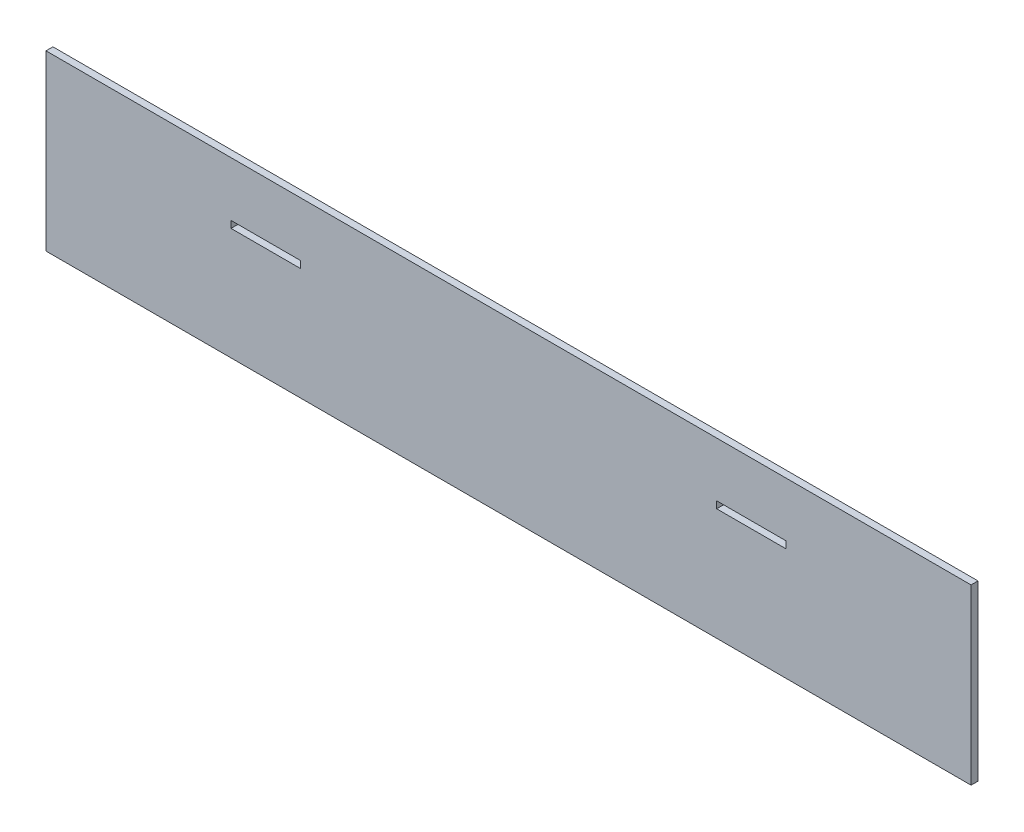
ISO-10303-21;
HEADER;
FILE_DESCRIPTION(('STEP AP214'),'2;1');
FILE_NAME('part.step','',(''),(''),'','','');
FILE_SCHEMA(('AUTOMOTIVE_DESIGN { 1 0 10303 214 1 1 1 1 }'));
ENDSEC;
DATA;
#1=APPLICATION_CONTEXT('core data for automotive mechanical design processes');
#2=APPLICATION_PROTOCOL_DEFINITION('international standard','automotive_design',2000,#1);
#3=PRODUCT_CONTEXT('',#1,'mechanical');
#4=PRODUCT('Part','Part','',(#3));
#5=PRODUCT_RELATED_PRODUCT_CATEGORY('part','',(#4));
#6=PRODUCT_DEFINITION_FORMATION('','',#4);
#7=PRODUCT_DEFINITION_CONTEXT('part definition',#1,'design');
#8=PRODUCT_DEFINITION('design','',#6,#7);
#9=PRODUCT_DEFINITION_SHAPE('','',#8);
#10=(LENGTH_UNIT() NAMED_UNIT(*) SI_UNIT(.MILLI.,.METRE.));
#11=(NAMED_UNIT(*) PLANE_ANGLE_UNIT() SI_UNIT($,.RADIAN.));
#12=(NAMED_UNIT(*) SI_UNIT($,.STERADIAN.) SOLID_ANGLE_UNIT());
#13=UNCERTAINTY_MEASURE_WITH_UNIT(LENGTH_MEASURE(1.E-05),#10,'distance_accuracy_value','');
#14=(GEOMETRIC_REPRESENTATION_CONTEXT(3) GLOBAL_UNCERTAINTY_ASSIGNED_CONTEXT((#13)) GLOBAL_UNIT_ASSIGNED_CONTEXT((#10,
#11,#12)) REPRESENTATION_CONTEXT('',''));
#15=CARTESIAN_POINT('',(0.,0.,0.));
#16=DIRECTION('',(0.,0.,1.));
#17=DIRECTION('',(1.,0.,0.));
#18=AXIS2_PLACEMENT_3D('',#15,#16,#17);
#19=CARTESIAN_POINT('',(0.,0.,3.));
#20=DIRECTION('',(0.,0.,1.));
#21=DIRECTION('',(1.,0.,0.));
#22=AXIS2_PLACEMENT_3D('',#19,#20,#21);
#23=PLANE('',#22);
#24=DIRECTION('',(0.,1.,0.));
#25=VECTOR('',#24,1.);
#26=CARTESIAN_POINT('',(200.,37.5,3.));
#27=LINE('',#26,#25);
#28=CARTESIAN_POINT('',(200.,-37.5,3.));
#29=VERTEX_POINT('',#28);
#30=CARTESIAN_POINT('',(200.,37.5,3.));
#31=VERTEX_POINT('',#30);
#32=EDGE_CURVE('E228',#29,#31,#27,.T.);
#33=ORIENTED_EDGE('',*,*,#32,.T.);
#34=DIRECTION('',(-1.,0.,0.));
#35=VECTOR('',#34,1.);
#36=CARTESIAN_POINT('',(-200.,37.5,3.));
#37=LINE('',#36,#35);
#38=CARTESIAN_POINT('',(-200.,37.5,3.));
#39=VERTEX_POINT('',#38);
#40=EDGE_CURVE('E232',#31,#39,#37,.T.);
#41=ORIENTED_EDGE('',*,*,#40,.T.);
#42=DIRECTION('',(0.,-1.,0.));
#43=VECTOR('',#42,1.);
#44=CARTESIAN_POINT('',(-200.,37.5,3.));
#45=LINE('',#44,#43);
#46=CARTESIAN_POINT('',(-200.,-37.5,3.));
#47=VERTEX_POINT('',#46);
#48=EDGE_CURVE('E236',#39,#47,#45,.T.);
#49=ORIENTED_EDGE('',*,*,#48,.T.);
#50=DIRECTION('',(1.,0.,0.));
#51=VECTOR('',#50,1.);
#52=CARTESIAN_POINT('',(-200.,-37.5,3.));
#53=LINE('',#52,#51);
#54=EDGE_CURVE('E239',#47,#29,#53,.T.);
#55=ORIENTED_EDGE('',*,*,#54,.T.);
#56=EDGE_LOOP('',(#33,#41,#49,#55));
#57=FACE_BOUND('',#56,.T.);
#58=DIRECTION('',(-1.,0.,0.));
#59=VECTOR('',#58,1.);
#60=CARTESIAN_POINT('',(-120.,14.,3.));
#61=LINE('',#60,#59);
#62=CARTESIAN_POINT('',(-90.,14.,3.));
#63=VERTEX_POINT('',#62);
#64=CARTESIAN_POINT('',(-120.,14.,3.));
#65=VERTEX_POINT('',#64);
#66=EDGE_CURVE('E188',#63,#65,#61,.T.);
#67=ORIENTED_EDGE('',*,*,#66,.F.);
#68=DIRECTION('',(0.,1.,0.));
#69=VECTOR('',#68,1.);
#70=CARTESIAN_POINT('',(-90.,14.,3.));
#71=LINE('',#70,#69);
#72=CARTESIAN_POINT('',(-90.,11.,3.));
#73=VERTEX_POINT('',#72);
#74=EDGE_CURVE('E185',#73,#63,#71,.T.);
#75=ORIENTED_EDGE('',*,*,#74,.F.);
#76=DIRECTION('',(1.,0.,0.));
#77=VECTOR('',#76,1.);
#78=CARTESIAN_POINT('',(-120.,11.,3.));
#79=LINE('',#78,#77);
#80=CARTESIAN_POINT('',(-120.,11.,3.));
#81=VERTEX_POINT('',#80);
#82=EDGE_CURVE('E196',#81,#73,#79,.T.);
#83=ORIENTED_EDGE('',*,*,#82,.F.);
#84=DIRECTION('',(0.,-1.,0.));
#85=VECTOR('',#84,1.);
#86=CARTESIAN_POINT('',(-120.,14.,3.));
#87=LINE('',#86,#85);
#88=EDGE_CURVE('E192',#65,#81,#87,.T.);
#89=ORIENTED_EDGE('',*,*,#88,.F.);
#90=EDGE_LOOP('',(#67,#75,#83,#89));
#91=FACE_BOUND('',#90,.T.);
#92=DIRECTION('',(0.,-1.,0.));
#93=VECTOR('',#92,1.);
#94=CARTESIAN_POINT('',(90.0000000000001,14.,3.));
#95=LINE('',#94,#93);
#96=CARTESIAN_POINT('',(90.0000000000001,14.,3.));
#97=VERTEX_POINT('',#96);
#98=CARTESIAN_POINT('',(90.0000000000001,11.,3.));
#99=VERTEX_POINT('',#98);
#100=EDGE_CURVE('E146',#97,#99,#95,.T.);
#101=ORIENTED_EDGE('',*,*,#100,.F.);
#102=DIRECTION('',(-1.,0.,0.));
#103=VECTOR('',#102,1.);
#104=CARTESIAN_POINT('',(120.,14.,3.));
#105=LINE('',#104,#103);
#106=CARTESIAN_POINT('',(120.,14.,3.));
#107=VERTEX_POINT('',#106);
#108=EDGE_CURVE('E137',#107,#97,#105,.T.);
#109=ORIENTED_EDGE('',*,*,#108,.F.);
#110=DIRECTION('',(0.,1.,0.));
#111=VECTOR('',#110,1.);
#112=CARTESIAN_POINT('',(120.,14.,3.));
#113=LINE('',#112,#111);
#114=CARTESIAN_POINT('',(120.,11.,3.));
#115=VERTEX_POINT('',#114);
#116=EDGE_CURVE('E163',#115,#107,#113,.T.);
#117=ORIENTED_EDGE('',*,*,#116,.F.);
#118=DIRECTION('',(1.,0.,0.));
#119=VECTOR('',#118,1.);
#120=CARTESIAN_POINT('',(120.,11.,3.));
#121=LINE('',#120,#119);
#122=EDGE_CURVE('E159',#99,#115,#121,.T.);
#123=ORIENTED_EDGE('',*,*,#122,.F.);
#124=EDGE_LOOP('',(#101,#109,#117,#123));
#125=FACE_BOUND('',#124,.T.);
#126=ADVANCED_FACE('F47',(#57,#91,#125),#23,.T.);
#127=CARTESIAN_POINT('',(0.,0.,0.));
#128=DIRECTION('',(0.,0.,1.));
#129=DIRECTION('',(1.,0.,0.));
#130=AXIS2_PLACEMENT_3D('',#127,#128,#129);
#131=PLANE('',#130);
#132=DIRECTION('',(0.,1.,0.));
#133=VECTOR('',#132,1.);
#134=CARTESIAN_POINT('',(-90.,14.,0.));
#135=LINE('',#134,#133);
#136=CARTESIAN_POINT('',(-90.,11.,0.));
#137=VERTEX_POINT('',#136);
#138=CARTESIAN_POINT('',(-90.,14.,0.));
#139=VERTEX_POINT('',#138);
#140=EDGE_CURVE('E155',#137,#139,#135,.T.);
#141=ORIENTED_EDGE('',*,*,#140,.T.);
#142=DIRECTION('',(-1.,0.,0.));
#143=VECTOR('',#142,1.);
#144=CARTESIAN_POINT('',(-120.,14.,0.));
#145=LINE('',#144,#143);
#146=CARTESIAN_POINT('',(-120.,14.,0.));
#147=VERTEX_POINT('',#146);
#148=EDGE_CURVE('E203',#139,#147,#145,.T.);
#149=ORIENTED_EDGE('',*,*,#148,.T.);
#150=DIRECTION('',(0.,-1.,0.));
#151=VECTOR('',#150,1.);
#152=CARTESIAN_POINT('',(-120.,14.,0.));
#153=LINE('',#152,#151);
#154=CARTESIAN_POINT('',(-120.,11.,0.));
#155=VERTEX_POINT('',#154);
#156=EDGE_CURVE('E207',#147,#155,#153,.T.);
#157=ORIENTED_EDGE('',*,*,#156,.T.);
#158=DIRECTION('',(1.,0.,0.));
#159=VECTOR('',#158,1.);
#160=CARTESIAN_POINT('',(-120.,11.,0.));
#161=LINE('',#160,#159);
#162=EDGE_CURVE('E189',#155,#137,#161,.T.);
#163=ORIENTED_EDGE('',*,*,#162,.T.);
#164=EDGE_LOOP('',(#141,#149,#157,#163));
#165=FACE_BOUND('',#164,.T.);
#166=DIRECTION('',(0.,1.,0.));
#167=VECTOR('',#166,1.);
#168=CARTESIAN_POINT('',(200.,37.5,0.));
#169=LINE('',#168,#167);
#170=CARTESIAN_POINT('',(200.,-37.5,0.));
#171=VERTEX_POINT('',#170);
#172=CARTESIAN_POINT('',(200.,37.5,0.));
#173=VERTEX_POINT('',#172);
#174=EDGE_CURVE('E227',#171,#173,#169,.T.);
#175=ORIENTED_EDGE('',*,*,#174,.F.);
#176=DIRECTION('',(1.,0.,0.));
#177=VECTOR('',#176,1.);
#178=CARTESIAN_POINT('',(-200.,-37.5,0.));
#179=LINE('',#178,#177);
#180=CARTESIAN_POINT('',(-200.,-37.5,0.));
#181=VERTEX_POINT('',#180);
#182=EDGE_CURVE('E233',#181,#171,#179,.T.);
#183=ORIENTED_EDGE('',*,*,#182,.F.);
#184=DIRECTION('',(0.,-1.,0.));
#185=VECTOR('',#184,1.);
#186=CARTESIAN_POINT('',(-200.,37.5,0.));
#187=LINE('',#186,#185);
#188=CARTESIAN_POINT('',(-200.,37.5,0.));
#189=VERTEX_POINT('',#188);
#190=EDGE_CURVE('E249',#189,#181,#187,.T.);
#191=ORIENTED_EDGE('',*,*,#190,.F.);
#192=DIRECTION('',(-1.,0.,0.));
#193=VECTOR('',#192,1.);
#194=CARTESIAN_POINT('',(-200.,37.5,0.));
#195=LINE('',#194,#193);
#196=EDGE_CURVE('E246',#173,#189,#195,.T.);
#197=ORIENTED_EDGE('',*,*,#196,.F.);
#198=EDGE_LOOP('',(#175,#183,#191,#197));
#199=FACE_BOUND('',#198,.T.);
#200=DIRECTION('',(-1.,0.,0.));
#201=VECTOR('',#200,1.);
#202=CARTESIAN_POINT('',(120.,14.,0.));
#203=LINE('',#202,#201);
#204=CARTESIAN_POINT('',(120.,14.,0.));
#205=VERTEX_POINT('',#204);
#206=CARTESIAN_POINT('',(90.0000000000001,14.,0.));
#207=VERTEX_POINT('',#206);
#208=EDGE_CURVE('E71',#205,#207,#203,.T.);
#209=ORIENTED_EDGE('',*,*,#208,.T.);
#210=DIRECTION('',(0.,-1.,0.));
#211=VECTOR('',#210,1.);
#212=CARTESIAN_POINT('',(90.0000000000001,14.,0.));
#213=LINE('',#212,#211);
#214=CARTESIAN_POINT('',(90.0000000000001,11.,0.));
#215=VERTEX_POINT('',#214);
#216=EDGE_CURVE('E153',#207,#215,#213,.T.);
#217=ORIENTED_EDGE('',*,*,#216,.T.);
#218=DIRECTION('',(1.,0.,0.));
#219=VECTOR('',#218,1.);
#220=CARTESIAN_POINT('',(120.,11.,0.));
#221=LINE('',#220,#219);
#222=CARTESIAN_POINT('',(120.,11.,0.));
#223=VERTEX_POINT('',#222);
#224=EDGE_CURVE('E172',#215,#223,#221,.T.);
#225=ORIENTED_EDGE('',*,*,#224,.T.);
#226=DIRECTION('',(0.,1.,0.));
#227=VECTOR('',#226,1.);
#228=CARTESIAN_POINT('',(120.,14.,0.));
#229=LINE('',#228,#227);
#230=EDGE_CURVE('E147',#223,#205,#229,.T.);
#231=ORIENTED_EDGE('',*,*,#230,.T.);
#232=EDGE_LOOP('',(#209,#217,#225,#231));
#233=FACE_BOUND('',#232,.T.);
#234=ADVANCED_FACE('F272',(#165,#199,#233),#131,.F.);
#235=CARTESIAN_POINT('',(200.,37.5,3.));
#236=DIRECTION('',(-1.,0.,0.));
#237=DIRECTION('',(0.,0.,1.));
#238=AXIS2_PLACEMENT_3D('',#235,#236,#237);
#239=PLANE('',#238);
#240=ORIENTED_EDGE('',*,*,#174,.T.);
#241=DIRECTION('',(0.,0.,-1.));
#242=VECTOR('',#241,1.);
#243=CARTESIAN_POINT('',(200.,37.5,3.));
#244=LINE('',#243,#242);
#245=EDGE_CURVE('E11',#31,#173,#244,.T.);
#246=ORIENTED_EDGE('',*,*,#245,.F.);
#247=ORIENTED_EDGE('',*,*,#32,.F.);
#248=DIRECTION('',(0.,0.,-1.));
#249=VECTOR('',#248,1.);
#250=CARTESIAN_POINT('',(200.,-37.5,3.));
#251=LINE('',#250,#249);
#252=EDGE_CURVE('E242',#29,#171,#251,.T.);
#253=ORIENTED_EDGE('',*,*,#252,.T.);
#254=EDGE_LOOP('',(#240,#246,#247,#253));
#255=FACE_BOUND('',#254,.T.);
#256=ADVANCED_FACE('F49',(#255),#239,.F.);
#257=CARTESIAN_POINT('',(-200.,37.5,3.));
#258=DIRECTION('',(0.,-1.,0.));
#259=DIRECTION('',(0.,0.,-1.));
#260=AXIS2_PLACEMENT_3D('',#257,#258,#259);
#261=PLANE('',#260);
#262=ORIENTED_EDGE('',*,*,#196,.T.);
#263=DIRECTION('',(0.,0.,-1.));
#264=VECTOR('',#263,1.);
#265=CARTESIAN_POINT('',(-200.,37.5,3.));
#266=LINE('',#265,#264);
#267=EDGE_CURVE('E56',#39,#189,#266,.T.);
#268=ORIENTED_EDGE('',*,*,#267,.F.);
#269=ORIENTED_EDGE('',*,*,#40,.F.);
#270=ORIENTED_EDGE('',*,*,#245,.T.);
#271=EDGE_LOOP('',(#262,#268,#269,#270));
#272=FACE_BOUND('',#271,.T.);
#273=ADVANCED_FACE('F283',(#272),#261,.F.);
#274=CARTESIAN_POINT('',(-200.,37.5,3.));
#275=DIRECTION('',(1.,0.,0.));
#276=DIRECTION('',(0.,0.,-1.));
#277=AXIS2_PLACEMENT_3D('',#274,#275,#276);
#278=PLANE('',#277);
#279=ORIENTED_EDGE('',*,*,#190,.T.);
#280=DIRECTION('',(0.,0.,-1.));
#281=VECTOR('',#280,1.);
#282=CARTESIAN_POINT('',(-200.,-37.5,3.));
#283=LINE('',#282,#281);
#284=EDGE_CURVE('E257',#47,#181,#283,.T.);
#285=ORIENTED_EDGE('',*,*,#284,.F.);
#286=ORIENTED_EDGE('',*,*,#48,.F.);
#287=ORIENTED_EDGE('',*,*,#267,.T.);
#288=EDGE_LOOP('',(#279,#285,#286,#287));
#289=FACE_BOUND('',#288,.T.);
#290=ADVANCED_FACE('F266',(#289),#278,.F.);
#291=CARTESIAN_POINT('',(-200.,-37.5,3.));
#292=DIRECTION('',(0.,1.,0.));
#293=DIRECTION('',(0.,0.,1.));
#294=AXIS2_PLACEMENT_3D('',#291,#292,#293);
#295=PLANE('',#294);
#296=ORIENTED_EDGE('',*,*,#182,.T.);
#297=ORIENTED_EDGE('',*,*,#252,.F.);
#298=ORIENTED_EDGE('',*,*,#54,.F.);
#299=ORIENTED_EDGE('',*,*,#284,.T.);
#300=EDGE_LOOP('',(#296,#297,#298,#299));
#301=FACE_BOUND('',#300,.T.);
#302=ADVANCED_FACE('F276',(#301),#295,.F.);
#303=CARTESIAN_POINT('',(-90.,14.,3.));
#304=DIRECTION('',(-1.,0.,0.));
#305=DIRECTION('',(0.,0.,1.));
#306=AXIS2_PLACEMENT_3D('',#303,#304,#305);
#307=PLANE('',#306);
#308=ORIENTED_EDGE('',*,*,#140,.F.);
#309=DIRECTION('',(0.,0.,-1.));
#310=VECTOR('',#309,1.);
#311=CARTESIAN_POINT('',(-90.,11.,3.));
#312=LINE('',#311,#310);
#313=EDGE_CURVE('E199',#73,#137,#312,.T.);
#314=ORIENTED_EDGE('',*,*,#313,.F.);
#315=ORIENTED_EDGE('',*,*,#74,.T.);
#316=DIRECTION('',(0.,0.,-1.));
#317=VECTOR('',#316,1.);
#318=CARTESIAN_POINT('',(-90.,14.,3.));
#319=LINE('',#318,#317);
#320=EDGE_CURVE('E223',#63,#139,#319,.T.);
#321=ORIENTED_EDGE('',*,*,#320,.T.);
#322=EDGE_LOOP('',(#308,#314,#315,#321));
#323=FACE_BOUND('',#322,.T.);
#324=ADVANCED_FACE('F298',(#323),#307,.T.);
#325=CARTESIAN_POINT('',(-120.,14.,3.));
#326=DIRECTION('',(0.,-1.,0.));
#327=DIRECTION('',(0.,0.,-1.));
#328=AXIS2_PLACEMENT_3D('',#325,#326,#327);
#329=PLANE('',#328);
#330=ORIENTED_EDGE('',*,*,#148,.F.);
#331=ORIENTED_EDGE('',*,*,#320,.F.);
#332=ORIENTED_EDGE('',*,*,#66,.T.);
#333=DIRECTION('',(0.,0.,-1.));
#334=VECTOR('',#333,1.);
#335=CARTESIAN_POINT('',(-120.,14.,3.));
#336=LINE('',#335,#334);
#337=EDGE_CURVE('E220',#65,#147,#336,.T.);
#338=ORIENTED_EDGE('',*,*,#337,.T.);
#339=EDGE_LOOP('',(#330,#331,#332,#338));
#340=FACE_BOUND('',#339,.T.);
#341=ADVANCED_FACE('F305',(#340),#329,.T.);
#342=CARTESIAN_POINT('',(-120.,14.,3.));
#343=DIRECTION('',(1.,0.,0.));
#344=DIRECTION('',(0.,0.,-1.));
#345=AXIS2_PLACEMENT_3D('',#342,#343,#344);
#346=PLANE('',#345);
#347=ORIENTED_EDGE('',*,*,#156,.F.);
#348=ORIENTED_EDGE('',*,*,#337,.F.);
#349=ORIENTED_EDGE('',*,*,#88,.T.);
#350=DIRECTION('',(0.,0.,-1.));
#351=VECTOR('',#350,1.);
#352=CARTESIAN_POINT('',(-120.,11.,3.));
#353=LINE('',#352,#351);
#354=EDGE_CURVE('E217',#81,#155,#353,.T.);
#355=ORIENTED_EDGE('',*,*,#354,.T.);
#356=EDGE_LOOP('',(#347,#348,#349,#355));
#357=FACE_BOUND('',#356,.T.);
#358=ADVANCED_FACE('F310',(#357),#346,.T.);
#359=CARTESIAN_POINT('',(-120.,11.,3.));
#360=DIRECTION('',(0.,1.,0.));
#361=DIRECTION('',(0.,0.,1.));
#362=AXIS2_PLACEMENT_3D('',#359,#360,#361);
#363=PLANE('',#362);
#364=ORIENTED_EDGE('',*,*,#162,.F.);
#365=ORIENTED_EDGE('',*,*,#354,.F.);
#366=ORIENTED_EDGE('',*,*,#82,.T.);
#367=ORIENTED_EDGE('',*,*,#313,.T.);
#368=EDGE_LOOP('',(#364,#365,#366,#367));
#369=FACE_BOUND('',#368,.T.);
#370=ADVANCED_FACE('F317',(#369),#363,.T.);
#371=CARTESIAN_POINT('',(120.,14.,3.));
#372=DIRECTION('',(0.,-1.,0.));
#373=DIRECTION('',(0.,0.,-1.));
#374=AXIS2_PLACEMENT_3D('',#371,#372,#373);
#375=PLANE('',#374);
#376=ORIENTED_EDGE('',*,*,#208,.F.);
#377=DIRECTION('',(0.,0.,-1.));
#378=VECTOR('',#377,1.);
#379=CARTESIAN_POINT('',(120.,14.,3.));
#380=LINE('',#379,#378);
#381=EDGE_CURVE('E141',#107,#205,#380,.T.);
#382=ORIENTED_EDGE('',*,*,#381,.F.);
#383=ORIENTED_EDGE('',*,*,#108,.T.);
#384=DIRECTION('',(0.,0.,-1.));
#385=VECTOR('',#384,1.);
#386=CARTESIAN_POINT('',(90.0000000000001,14.,3.));
#387=LINE('',#386,#385);
#388=EDGE_CURVE('E140',#97,#207,#387,.T.);
#389=ORIENTED_EDGE('',*,*,#388,.T.);
#390=EDGE_LOOP('',(#376,#382,#383,#389));
#391=FACE_BOUND('',#390,.T.);
#392=ADVANCED_FACE('F139',(#391),#375,.T.);
#393=CARTESIAN_POINT('',(90.0000000000001,14.,3.));
#394=DIRECTION('',(1.,0.,0.));
#395=DIRECTION('',(0.,0.,-1.));
#396=AXIS2_PLACEMENT_3D('',#393,#394,#395);
#397=PLANE('',#396);
#398=ORIENTED_EDGE('',*,*,#216,.F.);
#399=ORIENTED_EDGE('',*,*,#388,.F.);
#400=ORIENTED_EDGE('',*,*,#100,.T.);
#401=DIRECTION('',(0.,0.,-1.));
#402=VECTOR('',#401,1.);
#403=CARTESIAN_POINT('',(90.0000000000001,11.,3.));
#404=LINE('',#403,#402);
#405=EDGE_CURVE('E156',#99,#215,#404,.T.);
#406=ORIENTED_EDGE('',*,*,#405,.T.);
#407=EDGE_LOOP('',(#398,#399,#400,#406));
#408=FACE_BOUND('',#407,.T.);
#409=ADVANCED_FACE('F150',(#408),#397,.T.);
#410=CARTESIAN_POINT('',(120.,11.,3.));
#411=DIRECTION('',(0.,1.,0.));
#412=DIRECTION('',(0.,0.,1.));
#413=AXIS2_PLACEMENT_3D('',#410,#411,#412);
#414=PLANE('',#413);
#415=ORIENTED_EDGE('',*,*,#224,.F.);
#416=ORIENTED_EDGE('',*,*,#405,.F.);
#417=ORIENTED_EDGE('',*,*,#122,.T.);
#418=DIRECTION('',(0.,0.,-1.));
#419=VECTOR('',#418,1.);
#420=CARTESIAN_POINT('',(120.,11.,3.));
#421=LINE('',#420,#419);
#422=EDGE_CURVE('E63',#115,#223,#421,.T.);
#423=ORIENTED_EDGE('',*,*,#422,.T.);
#424=EDGE_LOOP('',(#415,#416,#417,#423));
#425=FACE_BOUND('',#424,.T.);
#426=ADVANCED_FACE('F335',(#425),#414,.T.);
#427=CARTESIAN_POINT('',(120.,14.,3.));
#428=DIRECTION('',(-1.,0.,0.));
#429=DIRECTION('',(0.,0.,1.));
#430=AXIS2_PLACEMENT_3D('',#427,#428,#429);
#431=PLANE('',#430);
#432=ORIENTED_EDGE('',*,*,#230,.F.);
#433=ORIENTED_EDGE('',*,*,#422,.F.);
#434=ORIENTED_EDGE('',*,*,#116,.T.);
#435=ORIENTED_EDGE('',*,*,#381,.T.);
#436=EDGE_LOOP('',(#432,#433,#434,#435));
#437=FACE_BOUND('',#436,.T.);
#438=ADVANCED_FACE('F338',(#437),#431,.T.);
#439=CLOSED_SHELL('',(#126,#234,#256,#273,#290,#302,#324,#341,#358,#370,#392,#409,#426,#438));
#440=MANIFOLD_SOLID_BREP('B2',#439);
#441=ADVANCED_BREP_SHAPE_REPRESENTATION('',(#18,#440),#14);
#442=SHAPE_DEFINITION_REPRESENTATION(#9,#441);
ENDSEC;
END-ISO-10303-21;
